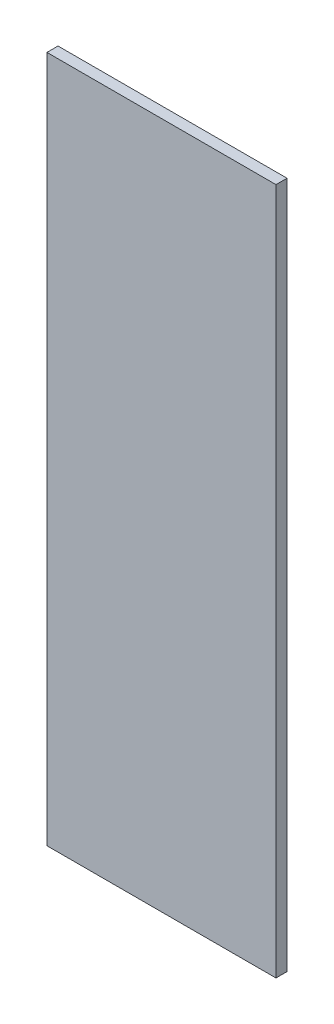
ISO-10303-21;
HEADER;
FILE_DESCRIPTION(('STEP AP214'),'2;1');
FILE_NAME('part.step','',(''),(''),'','','');
FILE_SCHEMA(('AUTOMOTIVE_DESIGN { 1 0 10303 214 1 1 1 1 }'));
ENDSEC;
DATA;
#1=APPLICATION_CONTEXT('core data for automotive mechanical design processes');
#2=APPLICATION_PROTOCOL_DEFINITION('international standard','automotive_design',2000,#1);
#3=PRODUCT_CONTEXT('',#1,'mechanical');
#4=PRODUCT('Part','Part','',(#3));
#5=PRODUCT_RELATED_PRODUCT_CATEGORY('part','',(#4));
#6=PRODUCT_DEFINITION_FORMATION('','',#4);
#7=PRODUCT_DEFINITION_CONTEXT('part definition',#1,'design');
#8=PRODUCT_DEFINITION('design','',#6,#7);
#9=PRODUCT_DEFINITION_SHAPE('','',#8);
#10=(LENGTH_UNIT() NAMED_UNIT(*) SI_UNIT(.MILLI.,.METRE.));
#11=(NAMED_UNIT(*) PLANE_ANGLE_UNIT() SI_UNIT($,.RADIAN.));
#12=(NAMED_UNIT(*) SI_UNIT($,.STERADIAN.) SOLID_ANGLE_UNIT());
#13=UNCERTAINTY_MEASURE_WITH_UNIT(LENGTH_MEASURE(1.E-05),#10,'distance_accuracy_value','');
#14=(GEOMETRIC_REPRESENTATION_CONTEXT(3) GLOBAL_UNCERTAINTY_ASSIGNED_CONTEXT((#13)) GLOBAL_UNIT_ASSIGNED_CONTEXT((#10,
#11,#12)) REPRESENTATION_CONTEXT('',''));
#15=CARTESIAN_POINT('',(0.,0.,0.));
#16=DIRECTION('',(0.,0.,1.));
#17=DIRECTION('',(1.,0.,0.));
#18=AXIS2_PLACEMENT_3D('',#15,#16,#17);
#19=CARTESIAN_POINT('',(0.,0.,2.9));
#20=DIRECTION('',(1.,0.,0.));
#21=DIRECTION('',(0.,0.,-1.));
#22=AXIS2_PLACEMENT_3D('',#19,#20,#21);
#23=PLANE('',#22);
#24=DIRECTION('',(0.,-1.,0.));
#25=VECTOR('',#24,1.);
#26=CARTESIAN_POINT('',(0.,0.,0.));
#27=LINE('',#26,#25);
#28=CARTESIAN_POINT('',(0.,180.,0.));
#29=VERTEX_POINT('',#28);
#30=CARTESIAN_POINT('',(0.,0.,0.));
#31=VERTEX_POINT('',#30);
#32=EDGE_CURVE('E96',#29,#31,#27,.T.);
#33=ORIENTED_EDGE('',*,*,#32,.T.);
#34=DIRECTION('',(0.,0.,-1.));
#35=VECTOR('',#34,1.);
#36=CARTESIAN_POINT('',(0.,0.,2.9));
#37=LINE('',#36,#35);
#38=CARTESIAN_POINT('',(0.,0.,2.9));
#39=VERTEX_POINT('',#38);
#40=EDGE_CURVE('E11',#39,#31,#37,.T.);
#41=ORIENTED_EDGE('',*,*,#40,.F.);
#42=DIRECTION('',(0.,-1.,0.));
#43=VECTOR('',#42,1.);
#44=CARTESIAN_POINT('',(0.,0.,2.9));
#45=LINE('',#44,#43);
#46=CARTESIAN_POINT('',(0.,180.,2.9));
#47=VERTEX_POINT('',#46);
#48=EDGE_CURVE('E84',#47,#39,#45,.T.);
#49=ORIENTED_EDGE('',*,*,#48,.F.);
#50=DIRECTION('',(0.,0.,-1.));
#51=VECTOR('',#50,1.);
#52=CARTESIAN_POINT('',(0.,180.,2.9));
#53=LINE('',#52,#51);
#54=EDGE_CURVE('E92',#47,#29,#53,.T.);
#55=ORIENTED_EDGE('',*,*,#54,.T.);
#56=EDGE_LOOP('',(#33,#41,#49,#55));
#57=FACE_BOUND('',#56,.T.);
#58=ADVANCED_FACE('F33',(#57),#23,.F.);
#59=CARTESIAN_POINT('',(0.,0.,2.9));
#60=DIRECTION('',(0.,1.,0.));
#61=DIRECTION('',(0.,0.,1.));
#62=AXIS2_PLACEMENT_3D('',#59,#60,#61);
#63=PLANE('',#62);
#64=DIRECTION('',(1.,0.,0.));
#65=VECTOR('',#64,1.);
#66=CARTESIAN_POINT('',(0.,0.,0.));
#67=LINE('',#66,#65);
#68=CARTESIAN_POINT('',(60.,0.,0.));
#69=VERTEX_POINT('',#68);
#70=EDGE_CURVE('E88',#31,#69,#67,.T.);
#71=ORIENTED_EDGE('',*,*,#70,.T.);
#72=DIRECTION('',(0.,0.,-1.));
#73=VECTOR('',#72,1.);
#74=CARTESIAN_POINT('',(60.,0.,2.9));
#75=LINE('',#74,#73);
#76=CARTESIAN_POINT('',(60.,0.,2.9));
#77=VERTEX_POINT('',#76);
#78=EDGE_CURVE('E41',#77,#69,#75,.T.);
#79=ORIENTED_EDGE('',*,*,#78,.F.);
#80=DIRECTION('',(1.,0.,0.));
#81=VECTOR('',#80,1.);
#82=CARTESIAN_POINT('',(0.,0.,2.9));
#83=LINE('',#82,#81);
#84=EDGE_CURVE('E79',#39,#77,#83,.T.);
#85=ORIENTED_EDGE('',*,*,#84,.F.);
#86=ORIENTED_EDGE('',*,*,#40,.T.);
#87=EDGE_LOOP('',(#71,#79,#85,#86));
#88=FACE_BOUND('',#87,.T.);
#89=ADVANCED_FACE('F87',(#88),#63,.F.);
#90=CARTESIAN_POINT('',(60.,0.,2.9));
#91=DIRECTION('',(-1.,0.,0.));
#92=DIRECTION('',(0.,0.,1.));
#93=AXIS2_PLACEMENT_3D('',#90,#91,#92);
#94=PLANE('',#93);
#95=DIRECTION('',(0.,1.,0.));
#96=VECTOR('',#95,1.);
#97=CARTESIAN_POINT('',(60.,0.,0.));
#98=LINE('',#97,#96);
#99=CARTESIAN_POINT('',(60.,180.,0.));
#100=VERTEX_POINT('',#99);
#101=EDGE_CURVE('E66',#69,#100,#98,.T.);
#102=ORIENTED_EDGE('',*,*,#101,.T.);
#103=DIRECTION('',(0.,0.,-1.));
#104=VECTOR('',#103,1.);
#105=CARTESIAN_POINT('',(60.,180.,2.9));
#106=LINE('',#105,#104);
#107=CARTESIAN_POINT('',(60.,180.,2.9));
#108=VERTEX_POINT('',#107);
#109=EDGE_CURVE('E89',#108,#100,#106,.T.);
#110=ORIENTED_EDGE('',*,*,#109,.F.);
#111=DIRECTION('',(0.,1.,0.));
#112=VECTOR('',#111,1.);
#113=CARTESIAN_POINT('',(60.,0.,2.9));
#114=LINE('',#113,#112);
#115=EDGE_CURVE('E82',#77,#108,#114,.T.);
#116=ORIENTED_EDGE('',*,*,#115,.F.);
#117=ORIENTED_EDGE('',*,*,#78,.T.);
#118=EDGE_LOOP('',(#102,#110,#116,#117));
#119=FACE_BOUND('',#118,.T.);
#120=ADVANCED_FACE('F90',(#119),#94,.F.);
#121=CARTESIAN_POINT('',(0.,180.,2.9));
#122=DIRECTION('',(0.,-1.,0.));
#123=DIRECTION('',(0.,0.,-1.));
#124=AXIS2_PLACEMENT_3D('',#121,#122,#123);
#125=PLANE('',#124);
#126=DIRECTION('',(-1.,0.,0.));
#127=VECTOR('',#126,1.);
#128=CARTESIAN_POINT('',(0.,180.,0.));
#129=LINE('',#128,#127);
#130=EDGE_CURVE('E72',#100,#29,#129,.T.);
#131=ORIENTED_EDGE('',*,*,#130,.T.);
#132=ORIENTED_EDGE('',*,*,#54,.F.);
#133=DIRECTION('',(-1.,0.,0.));
#134=VECTOR('',#133,1.);
#135=CARTESIAN_POINT('',(0.,180.,2.9));
#136=LINE('',#135,#134);
#137=EDGE_CURVE('E49',#108,#47,#136,.T.);
#138=ORIENTED_EDGE('',*,*,#137,.F.);
#139=ORIENTED_EDGE('',*,*,#109,.T.);
#140=EDGE_LOOP('',(#131,#132,#138,#139));
#141=FACE_BOUND('',#140,.T.);
#142=ADVANCED_FACE('F103',(#141),#125,.F.);
#143=CARTESIAN_POINT('',(0.,0.,2.9));
#144=DIRECTION('',(0.,0.,-1.));
#145=DIRECTION('',(-1.,0.,0.));
#146=AXIS2_PLACEMENT_3D('',#143,#144,#145);
#147=PLANE('',#146);
#148=ORIENTED_EDGE('',*,*,#48,.T.);
#149=ORIENTED_EDGE('',*,*,#84,.T.);
#150=ORIENTED_EDGE('',*,*,#115,.T.);
#151=ORIENTED_EDGE('',*,*,#137,.T.);
#152=EDGE_LOOP('',(#148,#149,#150,#151));
#153=FACE_BOUND('',#152,.T.);
#154=ADVANCED_FACE('F80',(#153),#147,.F.);
#155=CARTESIAN_POINT('',(0.,0.,0.));
#156=DIRECTION('',(0.,0.,-1.));
#157=DIRECTION('',(-1.,0.,0.));
#158=AXIS2_PLACEMENT_3D('',#155,#156,#157);
#159=PLANE('',#158);
#160=ORIENTED_EDGE('',*,*,#32,.F.);
#161=ORIENTED_EDGE('',*,*,#130,.F.);
#162=ORIENTED_EDGE('',*,*,#101,.F.);
#163=ORIENTED_EDGE('',*,*,#70,.F.);
#164=EDGE_LOOP('',(#160,#161,#162,#163));
#165=FACE_BOUND('',#164,.T.);
#166=ADVANCED_FACE('F106',(#165),#159,.T.);
#167=CLOSED_SHELL('',(#58,#89,#120,#142,#154,#166));
#168=MANIFOLD_SOLID_BREP('B2',#167);
#169=ADVANCED_BREP_SHAPE_REPRESENTATION('',(#18,#168),#14);
#170=SHAPE_DEFINITION_REPRESENTATION(#9,#169);
ENDSEC;
END-ISO-10303-21;
